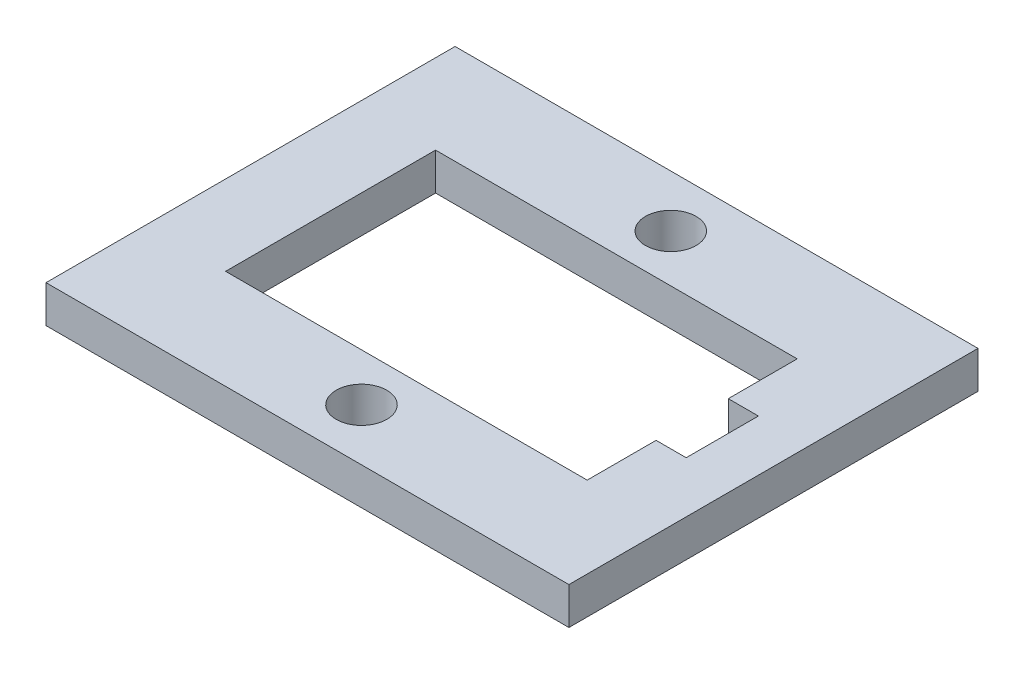
ISO-10303-21;
HEADER;
FILE_DESCRIPTION(('STEP AP214'),'2;1');
FILE_NAME('part.step','',(''),(''),'','','');
FILE_SCHEMA(('AUTOMOTIVE_DESIGN { 1 0 10303 214 1 1 1 1 }'));
ENDSEC;
DATA;
#1=APPLICATION_CONTEXT('core data for automotive mechanical design processes');
#2=APPLICATION_PROTOCOL_DEFINITION('international standard','automotive_design',2000,#1);
#3=PRODUCT_CONTEXT('',#1,'mechanical');
#4=PRODUCT('Part','Part','',(#3));
#5=PRODUCT_RELATED_PRODUCT_CATEGORY('part','',(#4));
#6=PRODUCT_DEFINITION_FORMATION('','',#4);
#7=PRODUCT_DEFINITION_CONTEXT('part definition',#1,'design');
#8=PRODUCT_DEFINITION('design','',#6,#7);
#9=PRODUCT_DEFINITION_SHAPE('','',#8);
#10=(LENGTH_UNIT() NAMED_UNIT(*) SI_UNIT(.MILLI.,.METRE.));
#11=(NAMED_UNIT(*) PLANE_ANGLE_UNIT() SI_UNIT($,.RADIAN.));
#12=(NAMED_UNIT(*) SI_UNIT($,.STERADIAN.) SOLID_ANGLE_UNIT());
#13=UNCERTAINTY_MEASURE_WITH_UNIT(LENGTH_MEASURE(1.E-05),#10,'distance_accuracy_value','');
#14=(GEOMETRIC_REPRESENTATION_CONTEXT(3) GLOBAL_UNCERTAINTY_ASSIGNED_CONTEXT((#13)) GLOBAL_UNIT_ASSIGNED_CONTEXT((#10,
#11,#12)) REPRESENTATION_CONTEXT('',''));
#15=CARTESIAN_POINT('',(0.,0.,0.));
#16=DIRECTION('',(0.,0.,1.));
#17=DIRECTION('',(1.,0.,0.));
#18=AXIS2_PLACEMENT_3D('',#15,#16,#17);
#19=CARTESIAN_POINT('',(0.,2.5,0.));
#20=DIRECTION('',(0.,1.,0.));
#21=DIRECTION('',(0.,0.,1.));
#22=AXIS2_PLACEMENT_3D('',#19,#20,#21);
#23=PLANE('',#22);
#24=CARTESIAN_POINT('',(0.275439534883728,2.5,-11.0288589804228));
#25=DIRECTION('',(0.,1.,0.));
#26=DIRECTION('',(0.,0.,1.));
#27=AXIS2_PLACEMENT_3D('',#24,#25,#26);
#28=CIRCLE('',#27,1.7);
#29=CARTESIAN_POINT('',(0.275439534883728,2.5,-9.32885898042284));
#30=VERTEX_POINT('',#29);
#31=EDGE_CURVE('E177',#30,#30,#28,.T.);
#32=ORIENTED_EDGE('',*,*,#31,.F.);
#33=EDGE_LOOP('',(#32));
#34=FACE_BOUND('',#33,.T.);
#35=DIRECTION('',(0.,0.,1.));
#36=VECTOR('',#35,1.);
#37=CARTESIAN_POINT('',(-17.7014916384778,2.5,-14.5165789804228));
#38=LINE('',#37,#36);
#39=CARTESIAN_POINT('',(-17.7014916384778,2.5,-14.5165789804228));
#40=VERTEX_POINT('',#39);
#41=CARTESIAN_POINT('',(-17.7014916384778,2.5,12.9615737795772));
#42=VERTEX_POINT('',#41);
#43=EDGE_CURVE('E221',#40,#42,#38,.T.);
#44=ORIENTED_EDGE('',*,*,#43,.T.);
#45=DIRECTION('',(1.,0.,0.));
#46=VECTOR('',#45,1.);
#47=CARTESIAN_POINT('',(-17.7014916384778,2.5,12.9615737795772));
#48=LINE('',#47,#46);
#49=CARTESIAN_POINT('',(17.4229383615222,2.5,12.9615737795772));
#50=VERTEX_POINT('',#49);
#51=EDGE_CURVE('E225',#42,#50,#48,.T.);
#52=ORIENTED_EDGE('',*,*,#51,.T.);
#53=DIRECTION('',(0.,0.,-1.));
#54=VECTOR('',#53,1.);
#55=CARTESIAN_POINT('',(17.4229383615222,2.5,-14.5165789804228));
#56=LINE('',#55,#54);
#57=CARTESIAN_POINT('',(17.4229383615222,2.5,-14.5165789804228));
#58=VERTEX_POINT('',#57);
#59=EDGE_CURVE('E229',#50,#58,#56,.T.);
#60=ORIENTED_EDGE('',*,*,#59,.T.);
#61=DIRECTION('',(-1.,0.,0.));
#62=VECTOR('',#61,1.);
#63=CARTESIAN_POINT('',(-17.7014916384778,2.5,-14.5165789804228));
#64=LINE('',#63,#62);
#65=EDGE_CURVE('E232',#58,#40,#64,.T.);
#66=ORIENTED_EDGE('',*,*,#65,.T.);
#67=EDGE_LOOP('',(#44,#52,#60,#66));
#68=FACE_BOUND('',#67,.T.);
#69=DIRECTION('',(1.,0.,0.));
#70=VECTOR('',#69,1.);
#71=CARTESIAN_POINT('',(11.9605883615222,2.5,6.27157377957716));
#72=LINE('',#71,#70);
#73=CARTESIAN_POINT('',(-12.3290016384778,2.5,6.27157377957716));
#74=VERTEX_POINT('',#73);
#75=CARTESIAN_POINT('',(11.9605883615222,2.5,6.27157377957716));
#76=VERTEX_POINT('',#75);
#77=EDGE_CURVE('E138',#74,#76,#72,.T.);
#78=ORIENTED_EDGE('',*,*,#77,.F.);
#79=DIRECTION('',(0.,0.,1.));
#80=VECTOR('',#79,1.);
#81=CARTESIAN_POINT('',(-12.3290016384778,2.5,6.27157377957716));
#82=LINE('',#81,#80);
#83=CARTESIAN_POINT('',(-12.3290016384778,2.5,-7.83354898042284));
#84=VERTEX_POINT('',#83);
#85=EDGE_CURVE('E129',#84,#74,#82,.T.);
#86=ORIENTED_EDGE('',*,*,#85,.F.);
#87=DIRECTION('',(-1.,0.,0.));
#88=VECTOR('',#87,1.);
#89=CARTESIAN_POINT('',(-12.3290016384778,2.5,-7.83354898042284));
#90=LINE('',#89,#88);
#91=CARTESIAN_POINT('',(11.9605883615222,2.5,-7.83354898042284));
#92=VERTEX_POINT('',#91);
#93=EDGE_CURVE('E172',#92,#84,#90,.T.);
#94=ORIENTED_EDGE('',*,*,#93,.F.);
#95=DIRECTION('',(0.,0.,-1.));
#96=VECTOR('',#95,1.);
#97=CARTESIAN_POINT('',(11.9605883615222,2.5,-7.83354898042284));
#98=LINE('',#97,#96);
#99=CARTESIAN_POINT('',(11.9605883615222,2.5,-3.20588260042284));
#100=VERTEX_POINT('',#99);
#101=EDGE_CURVE('E169',#100,#92,#98,.T.);
#102=ORIENTED_EDGE('',*,*,#101,.F.);
#103=DIRECTION('',(-1.,0.,0.));
#104=VECTOR('',#103,1.);
#105=CARTESIAN_POINT('',(11.9605883615222,2.5,-3.20588260042284));
#106=LINE('',#105,#104);
#107=CARTESIAN_POINT('',(13.9825383615222,2.5,-3.20588260042284));
#108=VERTEX_POINT('',#107);
#109=EDGE_CURVE('E166',#108,#100,#106,.T.);
#110=ORIENTED_EDGE('',*,*,#109,.F.);
#111=DIRECTION('',(0.,0.,-1.));
#112=VECTOR('',#111,1.);
#113=CARTESIAN_POINT('',(13.9825383615222,2.5,-3.20588260042284));
#114=LINE('',#113,#112);
#115=CARTESIAN_POINT('',(13.9825383615222,2.5,1.64390739957716));
#116=VERTEX_POINT('',#115);
#117=EDGE_CURVE('E163',#116,#108,#114,.T.);
#118=ORIENTED_EDGE('',*,*,#117,.F.);
#119=DIRECTION('',(1.,0.,0.));
#120=VECTOR('',#119,1.);
#121=CARTESIAN_POINT('',(13.9825383615222,2.5,1.64390739957716));
#122=LINE('',#121,#120);
#123=CARTESIAN_POINT('',(11.9605883615222,2.5,1.64390739957716));
#124=VERTEX_POINT('',#123);
#125=EDGE_CURVE('E157',#124,#116,#122,.T.);
#126=ORIENTED_EDGE('',*,*,#125,.F.);
#127=DIRECTION('',(0.,0.,-1.));
#128=VECTOR('',#127,1.);
#129=CARTESIAN_POINT('',(11.9605883615222,2.5,1.64390739957716));
#130=LINE('',#129,#128);
#131=EDGE_CURVE('E153',#76,#124,#130,.T.);
#132=ORIENTED_EDGE('',*,*,#131,.F.);
#133=EDGE_LOOP('',(#78,#86,#94,#102,#110,#118,#126,#132));
#134=FACE_BOUND('',#133,.T.);
#135=CARTESIAN_POINT('',(0.,2.5,9.47157377957716));
#136=DIRECTION('',(0.,1.,0.));
#137=DIRECTION('',(0.,0.,1.));
#138=AXIS2_PLACEMENT_3D('',#135,#136,#137);
#139=CIRCLE('',#138,1.7);
#140=CARTESIAN_POINT('',(0.,2.5,11.1715737795772));
#141=VERTEX_POINT('',#140);
#142=EDGE_CURVE('E338',#141,#141,#139,.T.);
#143=ORIENTED_EDGE('',*,*,#142,.F.);
#144=EDGE_LOOP('',(#143));
#145=FACE_BOUND('',#144,.T.);
#146=ADVANCED_FACE('F39',(#34,#68,#134,#145),#23,.T.);
#147=CARTESIAN_POINT('',(0.,0.,0.));
#148=DIRECTION('',(0.,1.,0.));
#149=DIRECTION('',(0.,0.,1.));
#150=AXIS2_PLACEMENT_3D('',#147,#148,#149);
#151=PLANE('',#150);
#152=DIRECTION('',(0.,0.,1.));
#153=VECTOR('',#152,1.);
#154=CARTESIAN_POINT('',(-17.7014916384778,0.,-14.5165789804228));
#155=LINE('',#154,#153);
#156=CARTESIAN_POINT('',(-17.7014916384778,0.,-14.5165789804228));
#157=VERTEX_POINT('',#156);
#158=CARTESIAN_POINT('',(-17.7014916384778,0.,12.9615737795772));
#159=VERTEX_POINT('',#158);
#160=EDGE_CURVE('E147',#157,#159,#155,.T.);
#161=ORIENTED_EDGE('',*,*,#160,.F.);
#162=DIRECTION('',(-1.,0.,0.));
#163=VECTOR('',#162,1.);
#164=CARTESIAN_POINT('',(-17.7014916384778,0.,-14.5165789804228));
#165=LINE('',#164,#163);
#166=CARTESIAN_POINT('',(17.4229383615222,0.,-14.5165789804228));
#167=VERTEX_POINT('',#166);
#168=EDGE_CURVE('E226',#167,#157,#165,.T.);
#169=ORIENTED_EDGE('',*,*,#168,.F.);
#170=DIRECTION('',(0.,0.,-1.));
#171=VECTOR('',#170,1.);
#172=CARTESIAN_POINT('',(17.4229383615222,0.,-14.5165789804228));
#173=LINE('',#172,#171);
#174=CARTESIAN_POINT('',(17.4229383615222,0.,12.9615737795772));
#175=VERTEX_POINT('',#174);
#176=EDGE_CURVE('E242',#175,#167,#173,.T.);
#177=ORIENTED_EDGE('',*,*,#176,.F.);
#178=DIRECTION('',(1.,0.,0.));
#179=VECTOR('',#178,1.);
#180=CARTESIAN_POINT('',(-17.7014916384778,0.,12.9615737795772));
#181=LINE('',#180,#179);
#182=EDGE_CURVE('E239',#159,#175,#181,.T.);
#183=ORIENTED_EDGE('',*,*,#182,.F.);
#184=EDGE_LOOP('',(#161,#169,#177,#183));
#185=FACE_BOUND('',#184,.T.);
#186=DIRECTION('',(0.,0.,1.));
#187=VECTOR('',#186,1.);
#188=CARTESIAN_POINT('',(-12.3290016384778,0.,6.27157377957716));
#189=LINE('',#188,#187);
#190=CARTESIAN_POINT('',(-12.3290016384778,0.,-7.83354898042284));
#191=VERTEX_POINT('',#190);
#192=CARTESIAN_POINT('',(-12.3290016384778,0.,6.27157377957716));
#193=VERTEX_POINT('',#192);
#194=EDGE_CURVE('E63',#191,#193,#189,.T.);
#195=ORIENTED_EDGE('',*,*,#194,.T.);
#196=DIRECTION('',(1.,0.,0.));
#197=VECTOR('',#196,1.);
#198=CARTESIAN_POINT('',(11.9605883615222,0.,6.27157377957716));
#199=LINE('',#198,#197);
#200=CARTESIAN_POINT('',(11.9605883615222,0.,6.27157377957716));
#201=VERTEX_POINT('',#200);
#202=EDGE_CURVE('E145',#193,#201,#199,.T.);
#203=ORIENTED_EDGE('',*,*,#202,.T.);
#204=DIRECTION('',(0.,0.,-1.));
#205=VECTOR('',#204,1.);
#206=CARTESIAN_POINT('',(11.9605883615222,0.,1.64390739957716));
#207=LINE('',#206,#205);
#208=CARTESIAN_POINT('',(11.9605883615222,0.,1.64390739957716));
#209=VERTEX_POINT('',#208);
#210=EDGE_CURVE('E180',#201,#209,#207,.T.);
#211=ORIENTED_EDGE('',*,*,#210,.T.);
#212=DIRECTION('',(1.,0.,0.));
#213=VECTOR('',#212,1.);
#214=CARTESIAN_POINT('',(13.9825383615222,0.,1.64390739957716));
#215=LINE('',#214,#213);
#216=CARTESIAN_POINT('',(13.9825383615222,0.,1.64390739957716));
#217=VERTEX_POINT('',#216);
#218=EDGE_CURVE('E184',#209,#217,#215,.T.);
#219=ORIENTED_EDGE('',*,*,#218,.T.);
#220=DIRECTION('',(0.,0.,-1.));
#221=VECTOR('',#220,1.);
#222=CARTESIAN_POINT('',(13.9825383615222,0.,-3.20588260042284));
#223=LINE('',#222,#221);
#224=CARTESIAN_POINT('',(13.9825383615222,0.,-3.20588260042284));
#225=VERTEX_POINT('',#224);
#226=EDGE_CURVE('E188',#217,#225,#223,.T.);
#227=ORIENTED_EDGE('',*,*,#226,.T.);
#228=DIRECTION('',(-1.,0.,0.));
#229=VECTOR('',#228,1.);
#230=CARTESIAN_POINT('',(11.9605883615222,0.,-3.20588260042284));
#231=LINE('',#230,#229);
#232=CARTESIAN_POINT('',(11.9605883615222,0.,-3.20588260042284));
#233=VERTEX_POINT('',#232);
#234=EDGE_CURVE('E192',#225,#233,#231,.T.);
#235=ORIENTED_EDGE('',*,*,#234,.T.);
#236=DIRECTION('',(0.,0.,-1.));
#237=VECTOR('',#236,1.);
#238=CARTESIAN_POINT('',(11.9605883615222,0.,-7.83354898042284));
#239=LINE('',#238,#237);
#240=CARTESIAN_POINT('',(11.9605883615222,0.,-7.83354898042284));
#241=VERTEX_POINT('',#240);
#242=EDGE_CURVE('E196',#233,#241,#239,.T.);
#243=ORIENTED_EDGE('',*,*,#242,.T.);
#244=DIRECTION('',(-1.,0.,0.));
#245=VECTOR('',#244,1.);
#246=CARTESIAN_POINT('',(-12.3290016384778,0.,-7.83354898042284));
#247=LINE('',#246,#245);
#248=EDGE_CURVE('E139',#241,#191,#247,.T.);
#249=ORIENTED_EDGE('',*,*,#248,.T.);
#250=EDGE_LOOP('',(#195,#203,#211,#219,#227,#235,#243,#249));
#251=FACE_BOUND('',#250,.T.);
#252=CARTESIAN_POINT('',(0.275439534883728,0.,-11.0288589804228));
#253=DIRECTION('',(0.,1.,0.));
#254=DIRECTION('',(0.,0.,1.));
#255=AXIS2_PLACEMENT_3D('',#252,#253,#254);
#256=CIRCLE('',#255,1.7);
#257=CARTESIAN_POINT('',(0.275439534883728,0.,-9.32885898042284));
#258=VERTEX_POINT('',#257);
#259=EDGE_CURVE('E346',#258,#258,#256,.T.);
#260=ORIENTED_EDGE('',*,*,#259,.T.);
#261=EDGE_LOOP('',(#260));
#262=FACE_BOUND('',#261,.T.);
#263=CARTESIAN_POINT('',(0.,0.,9.47157377957716));
#264=DIRECTION('',(0.,1.,0.));
#265=DIRECTION('',(0.,0.,1.));
#266=AXIS2_PLACEMENT_3D('',#263,#264,#265);
#267=CIRCLE('',#266,1.7);
#268=CARTESIAN_POINT('',(0.,0.,11.1715737795772));
#269=VERTEX_POINT('',#268);
#270=EDGE_CURVE('E341',#269,#269,#267,.T.);
#271=ORIENTED_EDGE('',*,*,#270,.T.);
#272=EDGE_LOOP('',(#271));
#273=FACE_BOUND('',#272,.T.);
#274=ADVANCED_FACE('F265',(#185,#251,#262,#273),#151,.F.);
#275=CARTESIAN_POINT('',(-17.7014916384778,2.5,-14.5165789804228));
#276=DIRECTION('',(1.,0.,0.));
#277=DIRECTION('',(0.,0.,-1.));
#278=AXIS2_PLACEMENT_3D('',#275,#276,#277);
#279=PLANE('',#278);
#280=ORIENTED_EDGE('',*,*,#160,.T.);
#281=DIRECTION('',(0.,-1.,0.));
#282=VECTOR('',#281,1.);
#283=CARTESIAN_POINT('',(-17.7014916384778,2.5,12.9615737795772));
#284=LINE('',#283,#282);
#285=EDGE_CURVE('E11',#42,#159,#284,.T.);
#286=ORIENTED_EDGE('',*,*,#285,.F.);
#287=ORIENTED_EDGE('',*,*,#43,.F.);
#288=DIRECTION('',(0.,-1.,0.));
#289=VECTOR('',#288,1.);
#290=CARTESIAN_POINT('',(-17.7014916384778,2.5,-14.5165789804228));
#291=LINE('',#290,#289);
#292=EDGE_CURVE('E235',#40,#157,#291,.T.);
#293=ORIENTED_EDGE('',*,*,#292,.T.);
#294=EDGE_LOOP('',(#280,#286,#287,#293));
#295=FACE_BOUND('',#294,.T.);
#296=ADVANCED_FACE('F41',(#295),#279,.F.);
#297=CARTESIAN_POINT('',(-17.7014916384778,2.5,12.9615737795772));
#298=DIRECTION('',(0.,0.,-1.));
#299=DIRECTION('',(-1.,0.,0.));
#300=AXIS2_PLACEMENT_3D('',#297,#298,#299);
#301=PLANE('',#300);
#302=ORIENTED_EDGE('',*,*,#182,.T.);
#303=DIRECTION('',(0.,-1.,0.));
#304=VECTOR('',#303,1.);
#305=CARTESIAN_POINT('',(17.4229383615222,2.5,12.9615737795772));
#306=LINE('',#305,#304);
#307=EDGE_CURVE('E48',#50,#175,#306,.T.);
#308=ORIENTED_EDGE('',*,*,#307,.F.);
#309=ORIENTED_EDGE('',*,*,#51,.F.);
#310=ORIENTED_EDGE('',*,*,#285,.T.);
#311=EDGE_LOOP('',(#302,#308,#309,#310));
#312=FACE_BOUND('',#311,.T.);
#313=ADVANCED_FACE('F275',(#312),#301,.F.);
#314=CARTESIAN_POINT('',(17.4229383615222,2.5,-14.5165789804228));
#315=DIRECTION('',(-1.,0.,0.));
#316=DIRECTION('',(0.,0.,1.));
#317=AXIS2_PLACEMENT_3D('',#314,#315,#316);
#318=PLANE('',#317);
#319=ORIENTED_EDGE('',*,*,#176,.T.);
#320=DIRECTION('',(0.,-1.,0.));
#321=VECTOR('',#320,1.);
#322=CARTESIAN_POINT('',(17.4229383615222,2.5,-14.5165789804228));
#323=LINE('',#322,#321);
#324=EDGE_CURVE('E250',#58,#167,#323,.T.);
#325=ORIENTED_EDGE('',*,*,#324,.F.);
#326=ORIENTED_EDGE('',*,*,#59,.F.);
#327=ORIENTED_EDGE('',*,*,#307,.T.);
#328=EDGE_LOOP('',(#319,#325,#326,#327));
#329=FACE_BOUND('',#328,.T.);
#330=ADVANCED_FACE('F259',(#329),#318,.F.);
#331=CARTESIAN_POINT('',(-17.7014916384778,2.5,-14.5165789804228));
#332=DIRECTION('',(0.,0.,1.));
#333=DIRECTION('',(1.,0.,0.));
#334=AXIS2_PLACEMENT_3D('',#331,#332,#333);
#335=PLANE('',#334);
#336=ORIENTED_EDGE('',*,*,#168,.T.);
#337=ORIENTED_EDGE('',*,*,#292,.F.);
#338=ORIENTED_EDGE('',*,*,#65,.F.);
#339=ORIENTED_EDGE('',*,*,#324,.T.);
#340=EDGE_LOOP('',(#336,#337,#338,#339));
#341=FACE_BOUND('',#340,.T.);
#342=ADVANCED_FACE('F269',(#341),#335,.F.);
#343=CARTESIAN_POINT('',(-12.3290016384778,2.5,6.27157377957716));
#344=DIRECTION('',(1.,0.,0.));
#345=DIRECTION('',(0.,0.,-1.));
#346=AXIS2_PLACEMENT_3D('',#343,#344,#345);
#347=PLANE('',#346);
#348=ORIENTED_EDGE('',*,*,#194,.F.);
#349=DIRECTION('',(0.,-1.,0.));
#350=VECTOR('',#349,1.);
#351=CARTESIAN_POINT('',(-12.3290016384778,2.5,-7.83354898042284));
#352=LINE('',#351,#350);
#353=EDGE_CURVE('E133',#84,#191,#352,.T.);
#354=ORIENTED_EDGE('',*,*,#353,.F.);
#355=ORIENTED_EDGE('',*,*,#85,.T.);
#356=DIRECTION('',(0.,-1.,0.));
#357=VECTOR('',#356,1.);
#358=CARTESIAN_POINT('',(-12.3290016384778,2.5,6.27157377957716));
#359=LINE('',#358,#357);
#360=EDGE_CURVE('E132',#74,#193,#359,.T.);
#361=ORIENTED_EDGE('',*,*,#360,.T.);
#362=EDGE_LOOP('',(#348,#354,#355,#361));
#363=FACE_BOUND('',#362,.T.);
#364=ADVANCED_FACE('F131',(#363),#347,.T.);
#365=CARTESIAN_POINT('',(11.9605883615222,2.5,6.27157377957716));
#366=DIRECTION('',(0.,0.,-1.));
#367=DIRECTION('',(-1.,0.,0.));
#368=AXIS2_PLACEMENT_3D('',#365,#366,#367);
#369=PLANE('',#368);
#370=ORIENTED_EDGE('',*,*,#202,.F.);
#371=ORIENTED_EDGE('',*,*,#360,.F.);
#372=ORIENTED_EDGE('',*,*,#77,.T.);
#373=DIRECTION('',(0.,-1.,0.));
#374=VECTOR('',#373,1.);
#375=CARTESIAN_POINT('',(11.9605883615222,2.5,6.27157377957716));
#376=LINE('',#375,#374);
#377=EDGE_CURVE('E148',#76,#201,#376,.T.);
#378=ORIENTED_EDGE('',*,*,#377,.T.);
#379=EDGE_LOOP('',(#370,#371,#372,#378));
#380=FACE_BOUND('',#379,.T.);
#381=ADVANCED_FACE('F142',(#380),#369,.T.);
#382=CARTESIAN_POINT('',(11.9605883615222,2.5,1.64390739957716));
#383=DIRECTION('',(-1.,0.,0.));
#384=DIRECTION('',(0.,0.,1.));
#385=AXIS2_PLACEMENT_3D('',#382,#383,#384);
#386=PLANE('',#385);
#387=ORIENTED_EDGE('',*,*,#210,.F.);
#388=ORIENTED_EDGE('',*,*,#377,.F.);
#389=ORIENTED_EDGE('',*,*,#131,.T.);
#390=DIRECTION('',(0.,-1.,0.));
#391=VECTOR('',#390,1.);
#392=CARTESIAN_POINT('',(11.9605883615222,2.5,1.64390739957716));
#393=LINE('',#392,#391);
#394=EDGE_CURVE('E216',#124,#209,#393,.T.);
#395=ORIENTED_EDGE('',*,*,#394,.T.);
#396=EDGE_LOOP('',(#387,#388,#389,#395));
#397=FACE_BOUND('',#396,.T.);
#398=ADVANCED_FACE('F300',(#397),#386,.T.);
#399=CARTESIAN_POINT('',(13.9825383615222,2.5,1.64390739957716));
#400=DIRECTION('',(0.,0.,-1.));
#401=DIRECTION('',(-1.,0.,0.));
#402=AXIS2_PLACEMENT_3D('',#399,#400,#401);
#403=PLANE('',#402);
#404=ORIENTED_EDGE('',*,*,#218,.F.);
#405=ORIENTED_EDGE('',*,*,#394,.F.);
#406=ORIENTED_EDGE('',*,*,#125,.T.);
#407=DIRECTION('',(0.,-1.,0.));
#408=VECTOR('',#407,1.);
#409=CARTESIAN_POINT('',(13.9825383615222,2.5,1.64390739957716));
#410=LINE('',#409,#408);
#411=EDGE_CURVE('E213',#116,#217,#410,.T.);
#412=ORIENTED_EDGE('',*,*,#411,.T.);
#413=EDGE_LOOP('',(#404,#405,#406,#412));
#414=FACE_BOUND('',#413,.T.);
#415=ADVANCED_FACE('F304',(#414),#403,.T.);
#416=CARTESIAN_POINT('',(13.9825383615222,2.5,-3.20588260042284));
#417=DIRECTION('',(-1.,0.,0.));
#418=DIRECTION('',(0.,0.,1.));
#419=AXIS2_PLACEMENT_3D('',#416,#417,#418);
#420=PLANE('',#419);
#421=ORIENTED_EDGE('',*,*,#226,.F.);
#422=ORIENTED_EDGE('',*,*,#411,.F.);
#423=ORIENTED_EDGE('',*,*,#117,.T.);
#424=DIRECTION('',(0.,-1.,0.));
#425=VECTOR('',#424,1.);
#426=CARTESIAN_POINT('',(13.9825383615222,2.5,-3.20588260042284));
#427=LINE('',#426,#425);
#428=EDGE_CURVE('E210',#108,#225,#427,.T.);
#429=ORIENTED_EDGE('',*,*,#428,.T.);
#430=EDGE_LOOP('',(#421,#422,#423,#429));
#431=FACE_BOUND('',#430,.T.);
#432=ADVANCED_FACE('F310',(#431),#420,.T.);
#433=CARTESIAN_POINT('',(11.9605883615222,2.5,-3.20588260042284));
#434=DIRECTION('',(0.,0.,1.));
#435=DIRECTION('',(1.,0.,0.));
#436=AXIS2_PLACEMENT_3D('',#433,#434,#435);
#437=PLANE('',#436);
#438=ORIENTED_EDGE('',*,*,#234,.F.);
#439=ORIENTED_EDGE('',*,*,#428,.F.);
#440=ORIENTED_EDGE('',*,*,#109,.T.);
#441=DIRECTION('',(0.,-1.,0.));
#442=VECTOR('',#441,1.);
#443=CARTESIAN_POINT('',(11.9605883615222,2.5,-3.20588260042284));
#444=LINE('',#443,#442);
#445=EDGE_CURVE('E207',#100,#233,#444,.T.);
#446=ORIENTED_EDGE('',*,*,#445,.T.);
#447=EDGE_LOOP('',(#438,#439,#440,#446));
#448=FACE_BOUND('',#447,.T.);
#449=ADVANCED_FACE('F314',(#448),#437,.T.);
#450=CARTESIAN_POINT('',(11.9605883615222,2.5,-7.83354898042284));
#451=DIRECTION('',(-1.,0.,0.));
#452=DIRECTION('',(0.,0.,1.));
#453=AXIS2_PLACEMENT_3D('',#450,#451,#452);
#454=PLANE('',#453);
#455=ORIENTED_EDGE('',*,*,#242,.F.);
#456=ORIENTED_EDGE('',*,*,#445,.F.);
#457=ORIENTED_EDGE('',*,*,#101,.T.);
#458=DIRECTION('',(0.,-1.,0.));
#459=VECTOR('',#458,1.);
#460=CARTESIAN_POINT('',(11.9605883615222,2.5,-7.83354898042284));
#461=LINE('',#460,#459);
#462=EDGE_CURVE('E55',#92,#241,#461,.T.);
#463=ORIENTED_EDGE('',*,*,#462,.T.);
#464=EDGE_LOOP('',(#455,#456,#457,#463));
#465=FACE_BOUND('',#464,.T.);
#466=ADVANCED_FACE('F318',(#465),#454,.T.);
#467=CARTESIAN_POINT('',(-12.3290016384778,2.5,-7.83354898042284));
#468=DIRECTION('',(0.,0.,1.));
#469=DIRECTION('',(1.,0.,0.));
#470=AXIS2_PLACEMENT_3D('',#467,#468,#469);
#471=PLANE('',#470);
#472=ORIENTED_EDGE('',*,*,#248,.F.);
#473=ORIENTED_EDGE('',*,*,#462,.F.);
#474=ORIENTED_EDGE('',*,*,#93,.T.);
#475=ORIENTED_EDGE('',*,*,#353,.T.);
#476=EDGE_LOOP('',(#472,#473,#474,#475));
#477=FACE_BOUND('',#476,.T.);
#478=ADVANCED_FACE('F322',(#477),#471,.T.);
#479=CARTESIAN_POINT('',(0.275439534883728,2.5,-11.0288589804228));
#480=DIRECTION('',(0.,-1.,0.));
#481=DIRECTION('',(0.,0.,-1.));
#482=AXIS2_PLACEMENT_3D('',#479,#480,#481);
#483=CYLINDRICAL_SURFACE('',#482,1.7);
#484=ORIENTED_EDGE('',*,*,#31,.T.);
#485=EDGE_LOOP('',(#484));
#486=FACE_BOUND('',#485,.T.);
#487=ORIENTED_EDGE('',*,*,#259,.F.);
#488=EDGE_LOOP('',(#487));
#489=FACE_BOUND('',#488,.T.);
#490=ADVANCED_FACE('F326',(#486,#489),#483,.F.);
#491=CARTESIAN_POINT('',(0.,2.5,9.47157377957716));
#492=DIRECTION('',(0.,-1.,0.));
#493=DIRECTION('',(0.,0.,-1.));
#494=AXIS2_PLACEMENT_3D('',#491,#492,#493);
#495=CYLINDRICAL_SURFACE('',#494,1.7);
#496=ORIENTED_EDGE('',*,*,#142,.T.);
#497=EDGE_LOOP('',(#496));
#498=FACE_BOUND('',#497,.T.);
#499=ORIENTED_EDGE('',*,*,#270,.F.);
#500=EDGE_LOOP('',(#499));
#501=FACE_BOUND('',#500,.T.);
#502=ADVANCED_FACE('F329',(#498,#501),#495,.F.);
#503=CLOSED_SHELL('',(#146,#274,#296,#313,#330,#342,#364,#381,#398,#415,#432,#449,#466,#478,
#490,#502));
#504=MANIFOLD_SOLID_BREP('B2',#503);
#505=ADVANCED_BREP_SHAPE_REPRESENTATION('',(#18,#504),#14);
#506=SHAPE_DEFINITION_REPRESENTATION(#9,#505);
ENDSEC;
END-ISO-10303-21;
